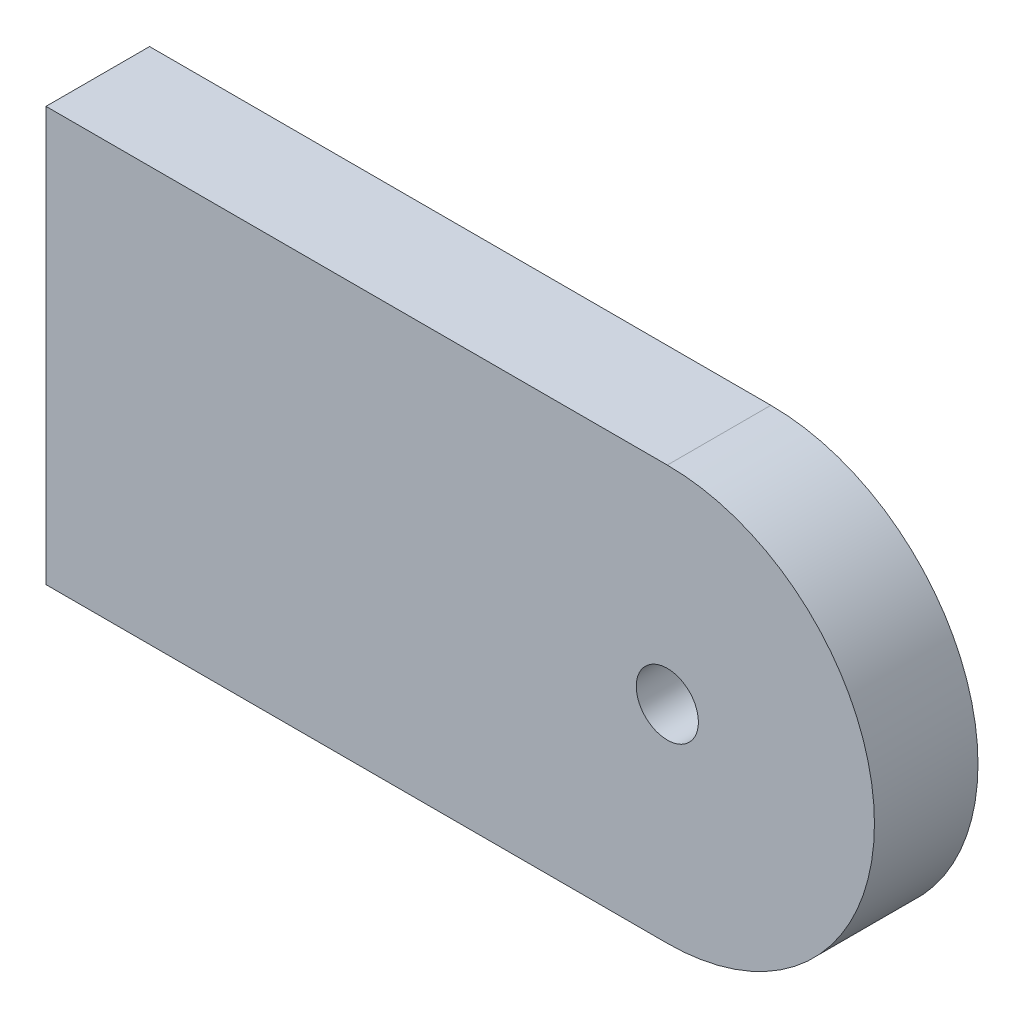
ISO-10303-21;
HEADER;
FILE_DESCRIPTION(('STEP AP214'),'2;1');
FILE_NAME('part.step','',(''),(''),'','','');
FILE_SCHEMA(('AUTOMOTIVE_DESIGN { 1 0 10303 214 1 1 1 1 }'));
ENDSEC;
DATA;
#1=APPLICATION_CONTEXT('core data for automotive mechanical design processes');
#2=APPLICATION_PROTOCOL_DEFINITION('international standard','automotive_design',2000,#1);
#3=PRODUCT_CONTEXT('',#1,'mechanical');
#4=PRODUCT('Part','Part','',(#3));
#5=PRODUCT_RELATED_PRODUCT_CATEGORY('part','',(#4));
#6=PRODUCT_DEFINITION_FORMATION('','',#4);
#7=PRODUCT_DEFINITION_CONTEXT('part definition',#1,'design');
#8=PRODUCT_DEFINITION('design','',#6,#7);
#9=PRODUCT_DEFINITION_SHAPE('','',#8);
#10=(LENGTH_UNIT() NAMED_UNIT(*) SI_UNIT(.MILLI.,.METRE.));
#11=(NAMED_UNIT(*) PLANE_ANGLE_UNIT() SI_UNIT($,.RADIAN.));
#12=(NAMED_UNIT(*) SI_UNIT($,.STERADIAN.) SOLID_ANGLE_UNIT());
#13=UNCERTAINTY_MEASURE_WITH_UNIT(LENGTH_MEASURE(1.E-05),#10,'distance_accuracy_value','');
#14=(GEOMETRIC_REPRESENTATION_CONTEXT(3) GLOBAL_UNCERTAINTY_ASSIGNED_CONTEXT((#13)) GLOBAL_UNIT_ASSIGNED_CONTEXT((#10,
#11,#12)) REPRESENTATION_CONTEXT('',''));
#15=CARTESIAN_POINT('',(0.,0.,0.));
#16=DIRECTION('',(0.,0.,1.));
#17=DIRECTION('',(1.,0.,0.));
#18=AXIS2_PLACEMENT_3D('',#15,#16,#17);
#19=CARTESIAN_POINT('',(10.,0.,5.));
#20=DIRECTION('',(0.,0.,1.));
#21=DIRECTION('',(1.,0.,0.));
#22=AXIS2_PLACEMENT_3D('',#19,#20,#21);
#23=PLANE('',#22);
#24=DIRECTION('',(0.,-1.,0.));
#25=VECTOR('',#24,1.);
#26=CARTESIAN_POINT('',(-20.,10.,5.));
#27=LINE('',#26,#25);
#28=CARTESIAN_POINT('',(-20.,10.,5.));
#29=VERTEX_POINT('',#28);
#30=CARTESIAN_POINT('',(-20.,-10.,5.));
#31=VERTEX_POINT('',#30);
#32=EDGE_CURVE('E92',#29,#31,#27,.T.);
#33=ORIENTED_EDGE('',*,*,#32,.T.);
#34=DIRECTION('',(1.,0.,0.));
#35=VECTOR('',#34,1.);
#36=CARTESIAN_POINT('',(-20.,-10.,5.));
#37=LINE('',#36,#35);
#38=CARTESIAN_POINT('',(10.,-10.,5.));
#39=VERTEX_POINT('',#38);
#40=EDGE_CURVE('E87',#31,#39,#37,.T.);
#41=ORIENTED_EDGE('',*,*,#40,.T.);
#42=CARTESIAN_POINT('',(10.,0.,5.));
#43=DIRECTION('',(0.,0.,1.));
#44=DIRECTION('',(1.,0.,0.));
#45=AXIS2_PLACEMENT_3D('',#42,#43,#44);
#46=CIRCLE('',#45,10.);
#47=CARTESIAN_POINT('',(10.,10.,5.));
#48=VERTEX_POINT('',#47);
#49=EDGE_CURVE('E90',#39,#48,#46,.T.);
#50=ORIENTED_EDGE('',*,*,#49,.T.);
#51=DIRECTION('',(-1.,0.,0.));
#52=VECTOR('',#51,1.);
#53=CARTESIAN_POINT('',(-20.,10.,5.));
#54=LINE('',#53,#52);
#55=EDGE_CURVE('E57',#48,#29,#54,.T.);
#56=ORIENTED_EDGE('',*,*,#55,.T.);
#57=EDGE_LOOP('',(#33,#41,#50,#56));
#58=FACE_BOUND('',#57,.T.);
#59=CARTESIAN_POINT('',(10.,0.,5.));
#60=DIRECTION('',(0.,0.,1.));
#61=DIRECTION('',(1.,0.,0.));
#62=AXIS2_PLACEMENT_3D('',#59,#60,#61);
#63=CIRCLE('',#62,1.5);
#64=CARTESIAN_POINT('',(11.5,0.,5.));
#65=VERTEX_POINT('',#64);
#66=EDGE_CURVE('E112',#65,#65,#63,.T.);
#67=ORIENTED_EDGE('',*,*,#66,.F.);
#68=EDGE_LOOP('',(#67));
#69=FACE_BOUND('',#68,.T.);
#70=ADVANCED_FACE('F39',(#58,#69),#23,.T.);
#71=CARTESIAN_POINT('',(10.,0.,0.));
#72=DIRECTION('',(0.,0.,1.));
#73=DIRECTION('',(1.,0.,0.));
#74=AXIS2_PLACEMENT_3D('',#71,#72,#73);
#75=PLANE('',#74);
#76=DIRECTION('',(0.,-1.,0.));
#77=VECTOR('',#76,1.);
#78=CARTESIAN_POINT('',(-20.,10.,0.));
#79=LINE('',#78,#77);
#80=CARTESIAN_POINT('',(-20.,10.,0.));
#81=VERTEX_POINT('',#80);
#82=CARTESIAN_POINT('',(-20.,-10.,0.));
#83=VERTEX_POINT('',#82);
#84=EDGE_CURVE('E108',#81,#83,#79,.T.);
#85=ORIENTED_EDGE('',*,*,#84,.F.);
#86=DIRECTION('',(-1.,0.,0.));
#87=VECTOR('',#86,1.);
#88=CARTESIAN_POINT('',(-20.,10.,0.));
#89=LINE('',#88,#87);
#90=CARTESIAN_POINT('',(10.,10.,0.));
#91=VERTEX_POINT('',#90);
#92=EDGE_CURVE('E80',#91,#81,#89,.T.);
#93=ORIENTED_EDGE('',*,*,#92,.F.);
#94=CARTESIAN_POINT('',(10.,0.,0.));
#95=DIRECTION('',(0.,0.,1.));
#96=DIRECTION('',(1.,0.,0.));
#97=AXIS2_PLACEMENT_3D('',#94,#95,#96);
#98=CIRCLE('',#97,10.);
#99=CARTESIAN_POINT('',(10.,-10.,0.));
#100=VERTEX_POINT('',#99);
#101=EDGE_CURVE('E74',#100,#91,#98,.T.);
#102=ORIENTED_EDGE('',*,*,#101,.F.);
#103=DIRECTION('',(1.,0.,0.));
#104=VECTOR('',#103,1.);
#105=CARTESIAN_POINT('',(-20.,-10.,0.));
#106=LINE('',#105,#104);
#107=EDGE_CURVE('E97',#83,#100,#106,.T.);
#108=ORIENTED_EDGE('',*,*,#107,.F.);
#109=EDGE_LOOP('',(#85,#93,#102,#108));
#110=FACE_BOUND('',#109,.T.);
#111=CARTESIAN_POINT('',(10.,0.,0.));
#112=DIRECTION('',(0.,0.,1.));
#113=DIRECTION('',(1.,0.,0.));
#114=AXIS2_PLACEMENT_3D('',#111,#112,#113);
#115=CIRCLE('',#114,1.5);
#116=CARTESIAN_POINT('',(11.5,0.,0.));
#117=VERTEX_POINT('',#116);
#118=EDGE_CURVE('E130',#117,#117,#115,.T.);
#119=ORIENTED_EDGE('',*,*,#118,.T.);
#120=EDGE_LOOP('',(#119));
#121=FACE_BOUND('',#120,.T.);
#122=ADVANCED_FACE('F125',(#110,#121),#75,.F.);
#123=CARTESIAN_POINT('',(-20.,10.,5.));
#124=DIRECTION('',(1.,0.,0.));
#125=DIRECTION('',(0.,0.,-1.));
#126=AXIS2_PLACEMENT_3D('',#123,#124,#125);
#127=PLANE('',#126);
#128=ORIENTED_EDGE('',*,*,#84,.T.);
#129=DIRECTION('',(0.,0.,-1.));
#130=VECTOR('',#129,1.);
#131=CARTESIAN_POINT('',(-20.,-10.,5.));
#132=LINE('',#131,#130);
#133=EDGE_CURVE('E11',#31,#83,#132,.T.);
#134=ORIENTED_EDGE('',*,*,#133,.F.);
#135=ORIENTED_EDGE('',*,*,#32,.F.);
#136=DIRECTION('',(0.,0.,-1.));
#137=VECTOR('',#136,1.);
#138=CARTESIAN_POINT('',(-20.,10.,5.));
#139=LINE('',#138,#137);
#140=EDGE_CURVE('E104',#29,#81,#139,.T.);
#141=ORIENTED_EDGE('',*,*,#140,.T.);
#142=EDGE_LOOP('',(#128,#134,#135,#141));
#143=FACE_BOUND('',#142,.T.);
#144=ADVANCED_FACE('F41',(#143),#127,.F.);
#145=CARTESIAN_POINT('',(-20.,-10.,5.));
#146=DIRECTION('',(0.,1.,0.));
#147=DIRECTION('',(-1.,0.,0.));
#148=AXIS2_PLACEMENT_3D('',#145,#146,#147);
#149=PLANE('',#148);
#150=ORIENTED_EDGE('',*,*,#107,.T.);
#151=DIRECTION('',(0.,0.,-1.));
#152=VECTOR('',#151,1.);
#153=CARTESIAN_POINT('',(10.,-10.,5.));
#154=LINE('',#153,#152);
#155=EDGE_CURVE('E49',#39,#100,#154,.T.);
#156=ORIENTED_EDGE('',*,*,#155,.F.);
#157=ORIENTED_EDGE('',*,*,#40,.F.);
#158=ORIENTED_EDGE('',*,*,#133,.T.);
#159=EDGE_LOOP('',(#150,#156,#157,#158));
#160=FACE_BOUND('',#159,.T.);
#161=ADVANCED_FACE('F96',(#160),#149,.F.);
#162=CARTESIAN_POINT('',(10.,0.,5.));
#163=DIRECTION('',(0.,0.,-1.));
#164=DIRECTION('',(-1.,0.,0.));
#165=AXIS2_PLACEMENT_3D('',#162,#163,#164);
#166=CYLINDRICAL_SURFACE('',#165,10.);
#167=ORIENTED_EDGE('',*,*,#101,.T.);
#168=DIRECTION('',(0.,0.,-1.));
#169=VECTOR('',#168,1.);
#170=CARTESIAN_POINT('',(10.,10.,5.));
#171=LINE('',#170,#169);
#172=EDGE_CURVE('E99',#48,#91,#171,.T.);
#173=ORIENTED_EDGE('',*,*,#172,.F.);
#174=ORIENTED_EDGE('',*,*,#49,.F.);
#175=ORIENTED_EDGE('',*,*,#155,.T.);
#176=EDGE_LOOP('',(#167,#173,#174,#175));
#177=FACE_BOUND('',#176,.T.);
#178=ADVANCED_FACE('F100',(#177),#166,.T.);
#179=CARTESIAN_POINT('',(-20.,10.,5.));
#180=DIRECTION('',(0.,-1.,0.));
#181=DIRECTION('',(0.,0.,-1.));
#182=AXIS2_PLACEMENT_3D('',#179,#180,#181);
#183=PLANE('',#182);
#184=ORIENTED_EDGE('',*,*,#92,.T.);
#185=ORIENTED_EDGE('',*,*,#140,.F.);
#186=ORIENTED_EDGE('',*,*,#55,.F.);
#187=ORIENTED_EDGE('',*,*,#172,.T.);
#188=EDGE_LOOP('',(#184,#185,#186,#187));
#189=FACE_BOUND('',#188,.T.);
#190=ADVANCED_FACE('F122',(#189),#183,.F.);
#191=CARTESIAN_POINT('',(10.,0.,5.));
#192=DIRECTION('',(0.,0.,-1.));
#193=DIRECTION('',(-1.,0.,0.));
#194=AXIS2_PLACEMENT_3D('',#191,#192,#193);
#195=CYLINDRICAL_SURFACE('',#194,1.5);
#196=ORIENTED_EDGE('',*,*,#66,.T.);
#197=EDGE_LOOP('',(#196));
#198=FACE_BOUND('',#197,.T.);
#199=ORIENTED_EDGE('',*,*,#118,.F.);
#200=EDGE_LOOP('',(#199));
#201=FACE_BOUND('',#200,.T.);
#202=ADVANCED_FACE('F138',(#198,#201),#195,.F.);
#203=CLOSED_SHELL('',(#70,#122,#144,#161,#178,#190,#202));
#204=MANIFOLD_SOLID_BREP('B2',#203);
#205=ADVANCED_BREP_SHAPE_REPRESENTATION('',(#18,#204),#14);
#206=SHAPE_DEFINITION_REPRESENTATION(#9,#205);
ENDSEC;
END-ISO-10303-21;
